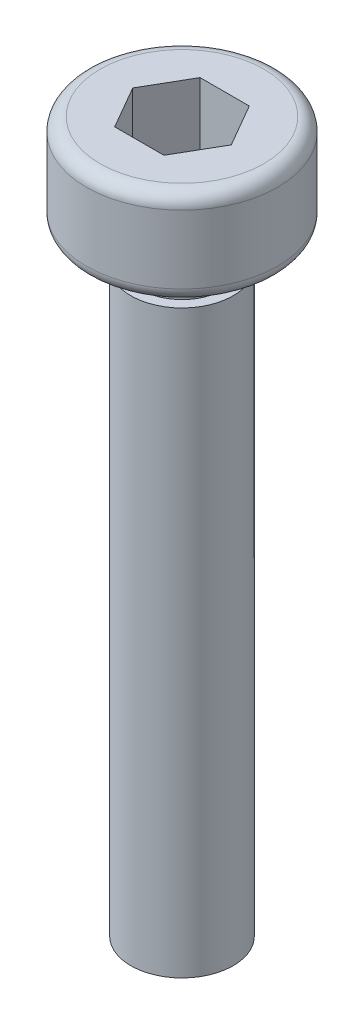
ISO-10303-21;
HEADER;
FILE_DESCRIPTION(('STEP AP214'),'2;1');
FILE_NAME('part.step','',(''),(''),'','','');
FILE_SCHEMA(('AUTOMOTIVE_DESIGN { 1 0 10303 214 1 1 1 1 }'));
ENDSEC;
DATA;
#1=APPLICATION_CONTEXT('core data for automotive mechanical design processes');
#2=APPLICATION_PROTOCOL_DEFINITION('international standard','automotive_design',2000,#1);
#3=PRODUCT_CONTEXT('',#1,'mechanical');
#4=PRODUCT('Part','Part','',(#3));
#5=PRODUCT_RELATED_PRODUCT_CATEGORY('part','',(#4));
#6=PRODUCT_DEFINITION_FORMATION('','',#4);
#7=PRODUCT_DEFINITION_CONTEXT('part definition',#1,'design');
#8=PRODUCT_DEFINITION('design','',#6,#7);
#9=PRODUCT_DEFINITION_SHAPE('','',#8);
#10=(LENGTH_UNIT() NAMED_UNIT(*) SI_UNIT(.MILLI.,.METRE.));
#11=(NAMED_UNIT(*) PLANE_ANGLE_UNIT() SI_UNIT($,.RADIAN.));
#12=(NAMED_UNIT(*) SI_UNIT($,.STERADIAN.) SOLID_ANGLE_UNIT());
#13=UNCERTAINTY_MEASURE_WITH_UNIT(LENGTH_MEASURE(1.E-05),#10,'distance_accuracy_value','');
#14=(GEOMETRIC_REPRESENTATION_CONTEXT(3) GLOBAL_UNCERTAINTY_ASSIGNED_CONTEXT((#13)) GLOBAL_UNIT_ASSIGNED_CONTEXT((#10,
#11,#12)) REPRESENTATION_CONTEXT('',''));
#15=CARTESIAN_POINT('',(0.,0.,0.));
#16=DIRECTION('',(0.,0.,1.));
#17=DIRECTION('',(1.,0.,0.));
#18=AXIS2_PLACEMENT_3D('',#15,#16,#17);
#19=CARTESIAN_POINT('',(0.,20.8,0.));
#20=DIRECTION('',(0.,-1.,0.));
#21=DIRECTION('',(0.,0.,-1.));
#22=AXIS2_PLACEMENT_3D('',#19,#20,#21);
#23=PLANE('',#22);
#24=DIRECTION('',(-0.5,0.,0.866025403784439));
#25=VECTOR('',#24,1.);
#26=CARTESIAN_POINT('',(-0.721687836487032,20.8,-1.25));
#27=LINE('',#26,#25);
#28=CARTESIAN_POINT('',(-0.721687836487032,20.8,-1.25));
#29=VERTEX_POINT('',#28);
#30=CARTESIAN_POINT('',(-1.44337567297406,20.8,0.));
#31=VERTEX_POINT('',#30);
#32=EDGE_CURVE('E126',#29,#31,#27,.T.);
#33=ORIENTED_EDGE('',*,*,#32,.F.);
#34=DIRECTION('',(-1.,0.,0.));
#35=VECTOR('',#34,1.);
#36=CARTESIAN_POINT('',(0.721687836487033,20.8,-1.25));
#37=LINE('',#36,#35);
#38=CARTESIAN_POINT('',(0.721687836487033,20.8,-1.25));
#39=VERTEX_POINT('',#38);
#40=EDGE_CURVE('E52',#39,#29,#37,.T.);
#41=ORIENTED_EDGE('',*,*,#40,.F.);
#42=DIRECTION('',(-0.5,0.,-0.866025403784439));
#43=VECTOR('',#42,1.);
#44=CARTESIAN_POINT('',(1.44337567297406,20.8,0.));
#45=LINE('',#44,#43);
#46=CARTESIAN_POINT('',(1.44337567297406,20.8,0.));
#47=VERTEX_POINT('',#46);
#48=EDGE_CURVE('E135',#47,#39,#45,.T.);
#49=ORIENTED_EDGE('',*,*,#48,.F.);
#50=DIRECTION('',(0.5,0.,-0.866025403784439));
#51=VECTOR('',#50,1.);
#52=CARTESIAN_POINT('',(0.721687836487032,20.8,1.25));
#53=LINE('',#52,#51);
#54=CARTESIAN_POINT('',(0.721687836487032,20.8,1.25));
#55=VERTEX_POINT('',#54);
#56=EDGE_CURVE('E133',#55,#47,#53,.T.);
#57=ORIENTED_EDGE('',*,*,#56,.F.);
#58=DIRECTION('',(1.,0.,0.));
#59=VECTOR('',#58,1.);
#60=CARTESIAN_POINT('',(-0.721687836487033,20.8,1.25));
#61=LINE('',#60,#59);
#62=CARTESIAN_POINT('',(-0.721687836487033,20.8,1.25));
#63=VERTEX_POINT('',#62);
#64=EDGE_CURVE('E100',#63,#55,#61,.T.);
#65=ORIENTED_EDGE('',*,*,#64,.F.);
#66=DIRECTION('',(0.5,0.,0.866025403784439));
#67=VECTOR('',#66,1.);
#68=CARTESIAN_POINT('',(-1.44337567297406,20.8,0.));
#69=LINE('',#68,#67);
#70=EDGE_CURVE('E129',#31,#63,#69,.T.);
#71=ORIENTED_EDGE('',*,*,#70,.F.);
#72=EDGE_LOOP('',(#33,#41,#49,#57,#65,#71));
#73=FACE_BOUND('',#72,.T.);
#74=CARTESIAN_POINT('',(0.,20.8,0.));
#75=DIRECTION('',(0.,-1.,0.));
#76=DIRECTION('',(0.,0.,-1.));
#77=AXIS2_PLACEMENT_3D('',#74,#75,#76);
#78=CIRCLE('',#77,2.4);
#79=CARTESIAN_POINT('',(0.,20.8,-2.4));
#80=VERTEX_POINT('',#79);
#81=EDGE_CURVE('E11',#80,#80,#78,.T.);
#82=ORIENTED_EDGE('',*,*,#81,.F.);
#83=EDGE_LOOP('',(#82));
#84=FACE_BOUND('',#83,.T.);
#85=ADVANCED_FACE('F38',(#73,#84),#23,.F.);
#86=CARTESIAN_POINT('',(0.,20.4,0.));
#87=DIRECTION('',(0.,-1.,0.));
#88=DIRECTION('',(0.,0.,-1.));
#89=AXIS2_PLACEMENT_3D('',#86,#87,#88);
#90=TOROIDAL_SURFACE('',#89,2.4,0.399999999999999);
#91=CARTESIAN_POINT('',(0.,20.4,0.));
#92=DIRECTION('',(0.,-1.,0.));
#93=DIRECTION('',(0.,0.,-1.));
#94=AXIS2_PLACEMENT_3D('',#91,#92,#93);
#95=CIRCLE('',#94,2.8);
#96=CARTESIAN_POINT('',(0.,20.4,-2.8));
#97=VERTEX_POINT('',#96);
#98=EDGE_CURVE('E45',#97,#97,#95,.T.);
#99=ORIENTED_EDGE('',*,*,#98,.F.);
#100=EDGE_LOOP('',(#99));
#101=FACE_BOUND('',#100,.T.);
#102=ORIENTED_EDGE('',*,*,#81,.T.);
#103=EDGE_LOOP('',(#102));
#104=FACE_BOUND('',#103,.T.);
#105=ADVANCED_FACE('F166',(#101,#104),#90,.T.);
#106=CARTESIAN_POINT('',(0.,0.,0.));
#107=DIRECTION('',(0.,-1.,0.));
#108=DIRECTION('',(0.,0.,-1.));
#109=AXIS2_PLACEMENT_3D('',#106,#107,#108);
#110=CYLINDRICAL_SURFACE('',#109,2.8);
#111=CARTESIAN_POINT('',(0.,18.4,0.));
#112=DIRECTION('',(0.,-1.,0.));
#113=DIRECTION('',(0.,0.,-1.));
#114=AXIS2_PLACEMENT_3D('',#111,#112,#113);
#115=CIRCLE('',#114,2.8);
#116=CARTESIAN_POINT('',(0.,18.4,-2.8));
#117=VERTEX_POINT('',#116);
#118=EDGE_CURVE('E159',#117,#117,#115,.T.);
#119=ORIENTED_EDGE('',*,*,#118,.F.);
#120=EDGE_LOOP('',(#119));
#121=FACE_BOUND('',#120,.T.);
#122=ORIENTED_EDGE('',*,*,#98,.T.);
#123=EDGE_LOOP('',(#122));
#124=FACE_BOUND('',#123,.T.);
#125=ADVANCED_FACE('F164',(#121,#124),#110,.T.);
#126=CARTESIAN_POINT('',(0.,18.4,0.));
#127=DIRECTION('',(0.,-1.,0.));
#128=DIRECTION('',(0.,0.,-1.));
#129=AXIS2_PLACEMENT_3D('',#126,#127,#128);
#130=TOROIDAL_SURFACE('',#129,2.4,0.400000000000003);
#131=CARTESIAN_POINT('',(0.,18.,0.));
#132=DIRECTION('',(0.,-1.,0.));
#133=DIRECTION('',(0.,0.,-1.));
#134=AXIS2_PLACEMENT_3D('',#131,#132,#133);
#135=CIRCLE('',#134,2.4);
#136=CARTESIAN_POINT('',(0.,18.,-2.4));
#137=VERTEX_POINT('',#136);
#138=EDGE_CURVE('E156',#137,#137,#135,.T.);
#139=ORIENTED_EDGE('',*,*,#138,.F.);
#140=EDGE_LOOP('',(#139));
#141=FACE_BOUND('',#140,.T.);
#142=ORIENTED_EDGE('',*,*,#118,.T.);
#143=EDGE_LOOP('',(#142));
#144=FACE_BOUND('',#143,.T.);
#145=ADVANCED_FACE('F211',(#141,#144),#130,.T.);
#146=CARTESIAN_POINT('',(-2.4,18.,0.));
#147=DIRECTION('',(0.,1.,0.));
#148=DIRECTION('',(0.,0.,1.));
#149=AXIS2_PLACEMENT_3D('',#146,#147,#148);
#150=PLANE('',#149);
#151=CARTESIAN_POINT('',(0.,18.,0.));
#152=DIRECTION('',(0.,-1.,0.));
#153=DIRECTION('',(0.,0.,-1.));
#154=AXIS2_PLACEMENT_3D('',#151,#152,#153);
#155=CIRCLE('',#154,1.2);
#156=CARTESIAN_POINT('',(0.,18.,-1.2));
#157=VERTEX_POINT('',#156);
#158=EDGE_CURVE('E153',#157,#157,#155,.T.);
#159=ORIENTED_EDGE('',*,*,#158,.F.);
#160=EDGE_LOOP('',(#159));
#161=FACE_BOUND('',#160,.T.);
#162=ORIENTED_EDGE('',*,*,#138,.T.);
#163=EDGE_LOOP('',(#162));
#164=FACE_BOUND('',#163,.T.);
#165=ADVANCED_FACE('F207',(#161,#164),#150,.F.);
#166=CARTESIAN_POINT('',(0.,0.,0.));
#167=DIRECTION('',(0.,-1.,0.));
#168=DIRECTION('',(0.,0.,-1.));
#169=AXIS2_PLACEMENT_3D('',#166,#167,#168);
#170=CYLINDRICAL_SURFACE('',#169,1.2);
#171=CARTESIAN_POINT('',(0.,17.,0.));
#172=DIRECTION('',(0.,-1.,0.));
#173=DIRECTION('',(0.,0.,-1.));
#174=AXIS2_PLACEMENT_3D('',#171,#172,#173);
#175=CIRCLE('',#174,1.2);
#176=CARTESIAN_POINT('',(0.,17.,-1.2));
#177=VERTEX_POINT('',#176);
#178=EDGE_CURVE('E150',#177,#177,#175,.T.);
#179=ORIENTED_EDGE('',*,*,#178,.F.);
#180=EDGE_LOOP('',(#179));
#181=FACE_BOUND('',#180,.T.);
#182=ORIENTED_EDGE('',*,*,#158,.T.);
#183=EDGE_LOOP('',(#182));
#184=FACE_BOUND('',#183,.T.);
#185=ADVANCED_FACE('F203',(#181,#184),#170,.T.);
#186=CARTESIAN_POINT('',(-1.2,17.,0.));
#187=DIRECTION('',(0.,-1.,0.));
#188=DIRECTION('',(0.,0.,-1.));
#189=AXIS2_PLACEMENT_3D('',#186,#187,#188);
#190=PLANE('',#189);
#191=CARTESIAN_POINT('',(0.,17.,0.));
#192=DIRECTION('',(0.,-1.,0.));
#193=DIRECTION('',(0.,0.,-1.));
#194=AXIS2_PLACEMENT_3D('',#191,#192,#193);
#195=CIRCLE('',#194,1.5);
#196=CARTESIAN_POINT('',(0.,17.,-1.5));
#197=VERTEX_POINT('',#196);
#198=EDGE_CURVE('E147',#197,#197,#195,.T.);
#199=ORIENTED_EDGE('',*,*,#198,.F.);
#200=EDGE_LOOP('',(#199));
#201=FACE_BOUND('',#200,.T.);
#202=ORIENTED_EDGE('',*,*,#178,.T.);
#203=EDGE_LOOP('',(#202));
#204=FACE_BOUND('',#203,.T.);
#205=ADVANCED_FACE('F199',(#201,#204),#190,.F.);
#206=CARTESIAN_POINT('',(0.,0.,0.));
#207=DIRECTION('',(0.,-1.,0.));
#208=DIRECTION('',(0.,0.,-1.));
#209=AXIS2_PLACEMENT_3D('',#206,#207,#208);
#210=CYLINDRICAL_SURFACE('',#209,1.5);
#211=CARTESIAN_POINT('',(0.,0.,0.));
#212=DIRECTION('',(0.,-1.,0.));
#213=DIRECTION('',(0.,0.,-1.));
#214=AXIS2_PLACEMENT_3D('',#211,#212,#213);
#215=CIRCLE('',#214,1.5);
#216=CARTESIAN_POINT('',(0.,0.,-1.5));
#217=VERTEX_POINT('',#216);
#218=EDGE_CURVE('E139',#217,#217,#215,.T.);
#219=ORIENTED_EDGE('',*,*,#218,.F.);
#220=EDGE_LOOP('',(#219));
#221=FACE_BOUND('',#220,.T.);
#222=ORIENTED_EDGE('',*,*,#198,.T.);
#223=EDGE_LOOP('',(#222));
#224=FACE_BOUND('',#223,.T.);
#225=ADVANCED_FACE('F191',(#221,#224),#210,.T.);
#226=CARTESIAN_POINT('',(-1.5,0.,0.));
#227=DIRECTION('',(0.,1.,0.));
#228=DIRECTION('',(0.,0.,1.));
#229=AXIS2_PLACEMENT_3D('',#226,#227,#228);
#230=PLANE('',#229);
#231=ORIENTED_EDGE('',*,*,#218,.T.);
#232=EDGE_LOOP('',(#231));
#233=FACE_BOUND('',#232,.T.);
#234=ADVANCED_FACE('F184',(#233),#230,.F.);
#235=CARTESIAN_POINT('',(0.721687836487033,18.8,-1.25));
#236=DIRECTION('',(0.,0.,-1.));
#237=DIRECTION('',(-1.,0.,0.));
#238=AXIS2_PLACEMENT_3D('',#235,#236,#237);
#239=PLANE('',#238);
#240=ORIENTED_EDGE('',*,*,#40,.T.);
#241=DIRECTION('',(0.,1.,0.));
#242=VECTOR('',#241,1.);
#243=CARTESIAN_POINT('',(-0.721687836487032,18.8,-1.25));
#244=LINE('',#243,#242);
#245=CARTESIAN_POINT('',(-0.721687836487032,18.8,-1.25));
#246=VERTEX_POINT('',#245);
#247=EDGE_CURVE('E82',#246,#29,#244,.T.);
#248=ORIENTED_EDGE('',*,*,#247,.F.);
#249=DIRECTION('',(-1.,0.,0.));
#250=VECTOR('',#249,1.);
#251=CARTESIAN_POINT('',(0.721687836487033,18.8,-1.25));
#252=LINE('',#251,#250);
#253=CARTESIAN_POINT('',(0.721687836487033,18.8,-1.25));
#254=VERTEX_POINT('',#253);
#255=EDGE_CURVE('E137',#254,#246,#252,.T.);
#256=ORIENTED_EDGE('',*,*,#255,.F.);
#257=DIRECTION('',(0.,1.,0.));
#258=VECTOR('',#257,1.);
#259=CARTESIAN_POINT('',(0.721687836487033,18.8,-1.25));
#260=LINE('',#259,#258);
#261=EDGE_CURVE('E60',#254,#39,#260,.T.);
#262=ORIENTED_EDGE('',*,*,#261,.T.);
#263=EDGE_LOOP('',(#240,#248,#256,#262));
#264=FACE_BOUND('',#263,.T.);
#265=ADVANCED_FACE('F181',(#264),#239,.F.);
#266=CARTESIAN_POINT('',(1.44337567297406,18.8,0.));
#267=DIRECTION('',(0.866025403784439,0.,-0.5));
#268=DIRECTION('',(-0.5,0.,-0.866025403784439));
#269=AXIS2_PLACEMENT_3D('',#266,#267,#268);
#270=PLANE('',#269);
#271=ORIENTED_EDGE('',*,*,#48,.T.);
#272=ORIENTED_EDGE('',*,*,#261,.F.);
#273=DIRECTION('',(-0.5,0.,-0.866025403784439));
#274=VECTOR('',#273,1.);
#275=CARTESIAN_POINT('',(1.44337567297406,18.8,0.));
#276=LINE('',#275,#274);
#277=CARTESIAN_POINT('',(1.44337567297406,18.8,0.));
#278=VERTEX_POINT('',#277);
#279=EDGE_CURVE('E112',#278,#254,#276,.T.);
#280=ORIENTED_EDGE('',*,*,#279,.F.);
#281=DIRECTION('',(0.,1.,0.));
#282=VECTOR('',#281,1.);
#283=CARTESIAN_POINT('',(1.44337567297406,18.8,0.));
#284=LINE('',#283,#282);
#285=EDGE_CURVE('E104',#278,#47,#284,.T.);
#286=ORIENTED_EDGE('',*,*,#285,.T.);
#287=EDGE_LOOP('',(#271,#272,#280,#286));
#288=FACE_BOUND('',#287,.T.);
#289=ADVANCED_FACE('F183',(#288),#270,.F.);
#290=CARTESIAN_POINT('',(0.721687836487032,18.8,1.25));
#291=DIRECTION('',(0.866025403784439,0.,0.5));
#292=DIRECTION('',(0.5,0.,-0.866025403784439));
#293=AXIS2_PLACEMENT_3D('',#290,#291,#292);
#294=PLANE('',#293);
#295=ORIENTED_EDGE('',*,*,#56,.T.);
#296=ORIENTED_EDGE('',*,*,#285,.F.);
#297=DIRECTION('',(0.5,0.,-0.866025403784439));
#298=VECTOR('',#297,1.);
#299=CARTESIAN_POINT('',(0.721687836487032,18.8,1.25));
#300=LINE('',#299,#298);
#301=CARTESIAN_POINT('',(0.721687836487032,18.8,1.25));
#302=VERTEX_POINT('',#301);
#303=EDGE_CURVE('E108',#302,#278,#300,.T.);
#304=ORIENTED_EDGE('',*,*,#303,.F.);
#305=DIRECTION('',(0.,1.,0.));
#306=VECTOR('',#305,1.);
#307=CARTESIAN_POINT('',(0.721687836487032,18.8,1.25));
#308=LINE('',#307,#306);
#309=EDGE_CURVE('E93',#302,#55,#308,.T.);
#310=ORIENTED_EDGE('',*,*,#309,.T.);
#311=EDGE_LOOP('',(#295,#296,#304,#310));
#312=FACE_BOUND('',#311,.T.);
#313=ADVANCED_FACE('F109',(#312),#294,.F.);
#314=CARTESIAN_POINT('',(-0.721687836487033,18.8,1.25));
#315=DIRECTION('',(0.,0.,1.));
#316=DIRECTION('',(1.,0.,0.));
#317=AXIS2_PLACEMENT_3D('',#314,#315,#316);
#318=PLANE('',#317);
#319=ORIENTED_EDGE('',*,*,#64,.T.);
#320=ORIENTED_EDGE('',*,*,#309,.F.);
#321=DIRECTION('',(1.,0.,0.));
#322=VECTOR('',#321,1.);
#323=CARTESIAN_POINT('',(-0.721687836487033,18.8,1.25));
#324=LINE('',#323,#322);
#325=CARTESIAN_POINT('',(-0.721687836487033,18.8,1.25));
#326=VERTEX_POINT('',#325);
#327=EDGE_CURVE('E97',#326,#302,#324,.T.);
#328=ORIENTED_EDGE('',*,*,#327,.F.);
#329=DIRECTION('',(0.,1.,0.));
#330=VECTOR('',#329,1.);
#331=CARTESIAN_POINT('',(-0.721687836487033,18.8,1.25));
#332=LINE('',#331,#330);
#333=EDGE_CURVE('E105',#326,#63,#332,.T.);
#334=ORIENTED_EDGE('',*,*,#333,.T.);
#335=EDGE_LOOP('',(#319,#320,#328,#334));
#336=FACE_BOUND('',#335,.T.);
#337=ADVANCED_FACE('F95',(#336),#318,.F.);
#338=CARTESIAN_POINT('',(-1.44337567297406,18.8,0.));
#339=DIRECTION('',(-0.866025403784439,0.,0.5));
#340=DIRECTION('',(0.5,0.,0.866025403784439));
#341=AXIS2_PLACEMENT_3D('',#338,#339,#340);
#342=PLANE('',#341);
#343=ORIENTED_EDGE('',*,*,#70,.T.);
#344=ORIENTED_EDGE('',*,*,#333,.F.);
#345=DIRECTION('',(0.5,0.,0.866025403784439));
#346=VECTOR('',#345,1.);
#347=CARTESIAN_POINT('',(-1.44337567297406,18.8,0.));
#348=LINE('',#347,#346);
#349=CARTESIAN_POINT('',(-1.44337567297406,18.8,0.));
#350=VERTEX_POINT('',#349);
#351=EDGE_CURVE('E118',#350,#326,#348,.T.);
#352=ORIENTED_EDGE('',*,*,#351,.F.);
#353=DIRECTION('',(0.,1.,0.));
#354=VECTOR('',#353,1.);
#355=CARTESIAN_POINT('',(-1.44337567297406,18.8,0.));
#356=LINE('',#355,#354);
#357=EDGE_CURVE('E142',#350,#31,#356,.T.);
#358=ORIENTED_EDGE('',*,*,#357,.T.);
#359=EDGE_LOOP('',(#343,#344,#352,#358));
#360=FACE_BOUND('',#359,.T.);
#361=ADVANCED_FACE('F282',(#360),#342,.F.);
#362=CARTESIAN_POINT('',(-0.721687836487032,18.8,-1.25));
#363=DIRECTION('',(-0.866025403784439,0.,-0.5));
#364=DIRECTION('',(-0.5,0.,0.866025403784439));
#365=AXIS2_PLACEMENT_3D('',#362,#363,#364);
#366=PLANE('',#365);
#367=ORIENTED_EDGE('',*,*,#32,.T.);
#368=ORIENTED_EDGE('',*,*,#357,.F.);
#369=DIRECTION('',(-0.5,0.,0.866025403784439));
#370=VECTOR('',#369,1.);
#371=CARTESIAN_POINT('',(-0.721687836487032,18.8,-1.25));
#372=LINE('',#371,#370);
#373=EDGE_CURVE('E120',#246,#350,#372,.T.);
#374=ORIENTED_EDGE('',*,*,#373,.F.);
#375=ORIENTED_EDGE('',*,*,#247,.T.);
#376=EDGE_LOOP('',(#367,#368,#374,#375));
#377=FACE_BOUND('',#376,.T.);
#378=ADVANCED_FACE('F179',(#377),#366,.F.);
#379=CARTESIAN_POINT('',(0.,18.8,0.));
#380=DIRECTION('',(0.,1.,0.));
#381=DIRECTION('',(0.,0.,1.));
#382=AXIS2_PLACEMENT_3D('',#379,#380,#381);
#383=PLANE('',#382);
#384=ORIENTED_EDGE('',*,*,#255,.T.);
#385=ORIENTED_EDGE('',*,*,#373,.T.);
#386=ORIENTED_EDGE('',*,*,#351,.T.);
#387=ORIENTED_EDGE('',*,*,#327,.T.);
#388=ORIENTED_EDGE('',*,*,#303,.T.);
#389=ORIENTED_EDGE('',*,*,#279,.T.);
#390=EDGE_LOOP('',(#384,#385,#386,#387,#388,#389));
#391=FACE_BOUND('',#390,.T.);
#392=ADVANCED_FACE('F115',(#391),#383,.T.);
#393=CLOSED_SHELL('',(#85,#105,#125,#145,#165,#185,#205,#225,#234,#265,#289,#313,#337,#361,#378,#392));
#394=MANIFOLD_SOLID_BREP('B2',#393);
#395=ADVANCED_BREP_SHAPE_REPRESENTATION('',(#18,#394),#14);
#396=SHAPE_DEFINITION_REPRESENTATION(#9,#395);
ENDSEC;
END-ISO-10303-21;
